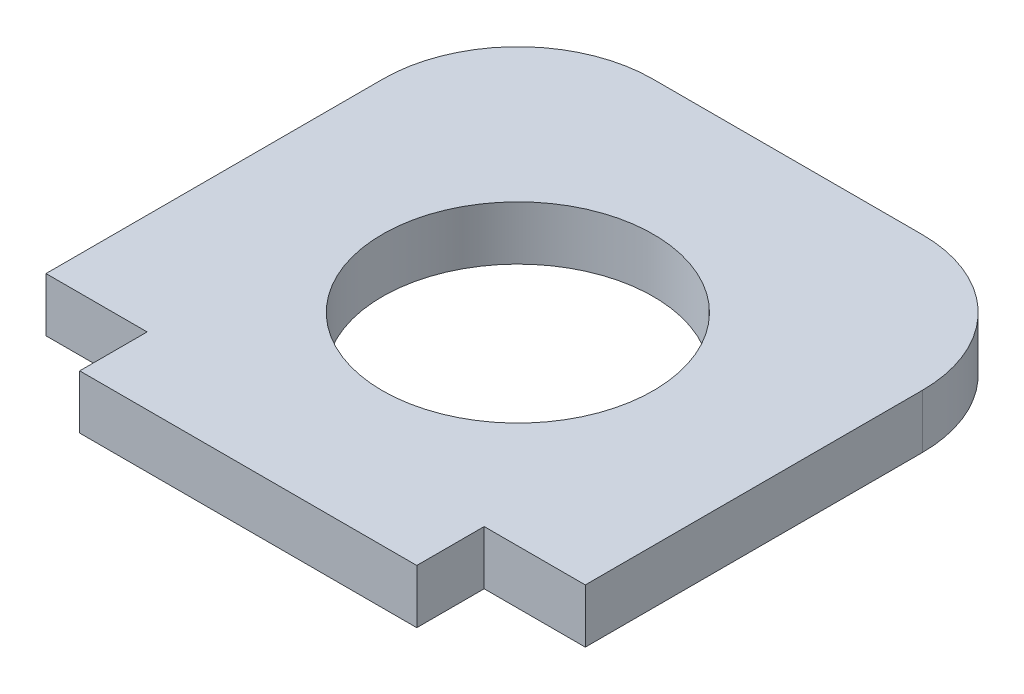
ISO-10303-21;
HEADER;
FILE_DESCRIPTION(('STEP AP214'),'2;1');
FILE_NAME('part.step','',(''),(''),'','','');
FILE_SCHEMA(('AUTOMOTIVE_DESIGN { 1 0 10303 214 1 1 1 1 }'));
ENDSEC;
DATA;
#1=APPLICATION_CONTEXT('core data for automotive mechanical design processes');
#2=APPLICATION_PROTOCOL_DEFINITION('international standard','automotive_design',2000,#1);
#3=PRODUCT_CONTEXT('',#1,'mechanical');
#4=PRODUCT('Part','Part','',(#3));
#5=PRODUCT_RELATED_PRODUCT_CATEGORY('part','',(#4));
#6=PRODUCT_DEFINITION_FORMATION('','',#4);
#7=PRODUCT_DEFINITION_CONTEXT('part definition',#1,'design');
#8=PRODUCT_DEFINITION('design','',#6,#7);
#9=PRODUCT_DEFINITION_SHAPE('','',#8);
#10=(LENGTH_UNIT() NAMED_UNIT(*) SI_UNIT(.MILLI.,.METRE.));
#11=(NAMED_UNIT(*) PLANE_ANGLE_UNIT() SI_UNIT($,.RADIAN.));
#12=(NAMED_UNIT(*) SI_UNIT($,.STERADIAN.) SOLID_ANGLE_UNIT());
#13=UNCERTAINTY_MEASURE_WITH_UNIT(LENGTH_MEASURE(1.E-05),#10,'distance_accuracy_value','');
#14=(GEOMETRIC_REPRESENTATION_CONTEXT(3) GLOBAL_UNCERTAINTY_ASSIGNED_CONTEXT((#13)) GLOBAL_UNIT_ASSIGNED_CONTEXT((#10,
#11,#12)) REPRESENTATION_CONTEXT('',''));
#15=CARTESIAN_POINT('',(0.,0.,0.));
#16=DIRECTION('',(0.,0.,1.));
#17=DIRECTION('',(1.,0.,0.));
#18=AXIS2_PLACEMENT_3D('',#15,#16,#17);
#19=CARTESIAN_POINT('',(12.5,4.,15.));
#20=DIRECTION('',(-1.,0.,0.));
#21=DIRECTION('',(0.,0.,1.));
#22=AXIS2_PLACEMENT_3D('',#19,#20,#21);
#23=PLANE('',#22);
#24=DIRECTION('',(0.,0.,-1.));
#25=VECTOR('',#24,1.);
#26=CARTESIAN_POINT('',(12.5,0.,15.));
#27=LINE('',#26,#25);
#28=CARTESIAN_POINT('',(12.5,0.,20.));
#29=VERTEX_POINT('',#28);
#30=CARTESIAN_POINT('',(12.5,0.,15.));
#31=VERTEX_POINT('',#30);
#32=EDGE_CURVE('E146',#29,#31,#27,.T.);
#33=ORIENTED_EDGE('',*,*,#32,.T.);
#34=DIRECTION('',(0.,-1.,0.));
#35=VECTOR('',#34,1.);
#36=CARTESIAN_POINT('',(12.5,4.,15.));
#37=LINE('',#36,#35);
#38=CARTESIAN_POINT('',(12.5,4.,15.));
#39=VERTEX_POINT('',#38);
#40=EDGE_CURVE('E129',#39,#31,#37,.T.);
#41=ORIENTED_EDGE('',*,*,#40,.F.);
#42=DIRECTION('',(0.,0.,-1.));
#43=VECTOR('',#42,1.);
#44=CARTESIAN_POINT('',(12.5,4.,15.));
#45=LINE('',#44,#43);
#46=CARTESIAN_POINT('',(12.5,4.,20.));
#47=VERTEX_POINT('',#46);
#48=EDGE_CURVE('E134',#47,#39,#45,.T.);
#49=ORIENTED_EDGE('',*,*,#48,.F.);
#50=DIRECTION('',(0.,-1.,0.));
#51=VECTOR('',#50,1.);
#52=CARTESIAN_POINT('',(12.5,4.,20.));
#53=LINE('',#52,#51);
#54=EDGE_CURVE('E194',#47,#29,#53,.T.);
#55=ORIENTED_EDGE('',*,*,#54,.T.);
#56=EDGE_LOOP('',(#33,#41,#49,#55));
#57=FACE_BOUND('',#56,.T.);
#58=ADVANCED_FACE('F45',(#57),#23,.F.);
#59=CARTESIAN_POINT('',(12.5,4.,15.));
#60=DIRECTION('',(0.,0.,-1.));
#61=DIRECTION('',(-1.,0.,0.));
#62=AXIS2_PLACEMENT_3D('',#59,#60,#61);
#63=PLANE('',#62);
#64=DIRECTION('',(1.,0.,0.));
#65=VECTOR('',#64,1.);
#66=CARTESIAN_POINT('',(12.5,0.,15.));
#67=LINE('',#66,#65);
#68=CARTESIAN_POINT('',(20.,0.,15.));
#69=VERTEX_POINT('',#68);
#70=EDGE_CURVE('E181',#31,#69,#67,.T.);
#71=ORIENTED_EDGE('',*,*,#70,.T.);
#72=DIRECTION('',(0.,-1.,0.));
#73=VECTOR('',#72,1.);
#74=CARTESIAN_POINT('',(20.,4.,15.));
#75=LINE('',#74,#73);
#76=CARTESIAN_POINT('',(20.,4.,15.));
#77=VERTEX_POINT('',#76);
#78=EDGE_CURVE('E132',#77,#69,#75,.T.);
#79=ORIENTED_EDGE('',*,*,#78,.F.);
#80=DIRECTION('',(1.,0.,0.));
#81=VECTOR('',#80,1.);
#82=CARTESIAN_POINT('',(12.5,4.,15.));
#83=LINE('',#82,#81);
#84=EDGE_CURVE('E125',#39,#77,#83,.T.);
#85=ORIENTED_EDGE('',*,*,#84,.F.);
#86=ORIENTED_EDGE('',*,*,#40,.T.);
#87=EDGE_LOOP('',(#71,#79,#85,#86));
#88=FACE_BOUND('',#87,.T.);
#89=ADVANCED_FACE('F127',(#88),#63,.F.);
#90=CARTESIAN_POINT('',(20.,4.,15.));
#91=DIRECTION('',(-1.,0.,0.));
#92=DIRECTION('',(0.,0.,1.));
#93=AXIS2_PLACEMENT_3D('',#90,#91,#92);
#94=PLANE('',#93);
#95=DIRECTION('',(0.,0.,-1.));
#96=VECTOR('',#95,1.);
#97=CARTESIAN_POINT('',(20.,0.,15.));
#98=LINE('',#97,#96);
#99=CARTESIAN_POINT('',(20.,0.,-10.));
#100=VERTEX_POINT('',#99);
#101=EDGE_CURVE('E178',#69,#100,#98,.T.);
#102=ORIENTED_EDGE('',*,*,#101,.T.);
#103=DIRECTION('',(0.,-1.,0.));
#104=VECTOR('',#103,1.);
#105=CARTESIAN_POINT('',(20.,4.,-10.));
#106=LINE('',#105,#104);
#107=CARTESIAN_POINT('',(20.,4.,-10.));
#108=VERTEX_POINT('',#107);
#109=EDGE_CURVE('E68',#100,#108,#106,.F.);
#110=ORIENTED_EDGE('',*,*,#109,.T.);
#111=DIRECTION('',(0.,0.,-1.));
#112=VECTOR('',#111,1.);
#113=CARTESIAN_POINT('',(20.,4.,15.));
#114=LINE('',#113,#112);
#115=EDGE_CURVE('E133',#77,#108,#114,.T.);
#116=ORIENTED_EDGE('',*,*,#115,.F.);
#117=ORIENTED_EDGE('',*,*,#78,.T.);
#118=EDGE_LOOP('',(#102,#110,#116,#117));
#119=FACE_BOUND('',#118,.T.);
#120=ADVANCED_FACE('F180',(#119),#94,.F.);
#121=CARTESIAN_POINT('',(20.,4.,-20.));
#122=DIRECTION('',(0.,0.,1.));
#123=DIRECTION('',(1.,0.,0.));
#124=AXIS2_PLACEMENT_3D('',#121,#122,#123);
#125=PLANE('',#124);
#126=DIRECTION('',(-1.,0.,0.));
#127=VECTOR('',#126,1.);
#128=CARTESIAN_POINT('',(20.,4.,-20.));
#129=LINE('',#128,#127);
#130=CARTESIAN_POINT('',(10.,4.,-20.));
#131=VERTEX_POINT('',#130);
#132=CARTESIAN_POINT('',(-10.,4.,-20.));
#133=VERTEX_POINT('',#132);
#134=EDGE_CURVE('E164',#131,#133,#129,.T.);
#135=ORIENTED_EDGE('',*,*,#134,.F.);
#136=DIRECTION('',(0.,-1.,0.));
#137=VECTOR('',#136,1.);
#138=CARTESIAN_POINT('',(10.,4.,-20.));
#139=LINE('',#138,#137);
#140=CARTESIAN_POINT('',(10.,0.,-20.));
#141=VERTEX_POINT('',#140);
#142=EDGE_CURVE('E149',#131,#141,#139,.T.);
#143=ORIENTED_EDGE('',*,*,#142,.T.);
#144=DIRECTION('',(-1.,0.,0.));
#145=VECTOR('',#144,1.);
#146=CARTESIAN_POINT('',(20.,0.,-20.));
#147=LINE('',#146,#145);
#148=CARTESIAN_POINT('',(-10.,0.,-20.));
#149=VERTEX_POINT('',#148);
#150=EDGE_CURVE('E179',#141,#149,#147,.T.);
#151=ORIENTED_EDGE('',*,*,#150,.T.);
#152=DIRECTION('',(0.,-1.,0.));
#153=VECTOR('',#152,1.);
#154=CARTESIAN_POINT('',(-10.,4.,-20.));
#155=LINE('',#154,#153);
#156=EDGE_CURVE('E147',#149,#133,#155,.F.);
#157=ORIENTED_EDGE('',*,*,#156,.T.);
#158=EDGE_LOOP('',(#135,#143,#151,#157));
#159=FACE_BOUND('',#158,.T.);
#160=ADVANCED_FACE('F168',(#159),#125,.F.);
#161=CARTESIAN_POINT('',(-20.,4.,15.));
#162=DIRECTION('',(1.,0.,0.));
#163=DIRECTION('',(0.,0.,-1.));
#164=AXIS2_PLACEMENT_3D('',#161,#162,#163);
#165=PLANE('',#164);
#166=DIRECTION('',(0.,0.,1.));
#167=VECTOR('',#166,1.);
#168=CARTESIAN_POINT('',(-20.,4.,15.));
#169=LINE('',#168,#167);
#170=CARTESIAN_POINT('',(-20.,4.,-10.));
#171=VERTEX_POINT('',#170);
#172=CARTESIAN_POINT('',(-20.,4.,15.));
#173=VERTEX_POINT('',#172);
#174=EDGE_CURVE('E172',#171,#173,#169,.T.);
#175=ORIENTED_EDGE('',*,*,#174,.F.);
#176=DIRECTION('',(0.,-1.,0.));
#177=VECTOR('',#176,1.);
#178=CARTESIAN_POINT('',(-20.,4.,-10.));
#179=LINE('',#178,#177);
#180=CARTESIAN_POINT('',(-20.,0.,-10.));
#181=VERTEX_POINT('',#180);
#182=EDGE_CURVE('E11',#171,#181,#179,.T.);
#183=ORIENTED_EDGE('',*,*,#182,.T.);
#184=DIRECTION('',(0.,0.,1.));
#185=VECTOR('',#184,1.);
#186=CARTESIAN_POINT('',(-20.,0.,15.));
#187=LINE('',#186,#185);
#188=CARTESIAN_POINT('',(-20.,0.,15.));
#189=VERTEX_POINT('',#188);
#190=EDGE_CURVE('E183',#181,#189,#187,.T.);
#191=ORIENTED_EDGE('',*,*,#190,.T.);
#192=DIRECTION('',(0.,-1.,0.));
#193=VECTOR('',#192,1.);
#194=CARTESIAN_POINT('',(-20.,4.,15.));
#195=LINE('',#194,#193);
#196=EDGE_CURVE('E151',#173,#189,#195,.T.);
#197=ORIENTED_EDGE('',*,*,#196,.F.);
#198=EDGE_LOOP('',(#175,#183,#191,#197));
#199=FACE_BOUND('',#198,.T.);
#200=ADVANCED_FACE('F234',(#199),#165,.F.);
#201=CARTESIAN_POINT('',(-20.,4.,15.));
#202=DIRECTION('',(0.,0.,-1.));
#203=DIRECTION('',(-1.,0.,0.));
#204=AXIS2_PLACEMENT_3D('',#201,#202,#203);
#205=PLANE('',#204);
#206=DIRECTION('',(1.,0.,0.));
#207=VECTOR('',#206,1.);
#208=CARTESIAN_POINT('',(-20.,0.,15.));
#209=LINE('',#208,#207);
#210=CARTESIAN_POINT('',(-12.5,0.,15.));
#211=VERTEX_POINT('',#210);
#212=EDGE_CURVE('E189',#189,#211,#209,.T.);
#213=ORIENTED_EDGE('',*,*,#212,.T.);
#214=DIRECTION('',(0.,-1.,0.));
#215=VECTOR('',#214,1.);
#216=CARTESIAN_POINT('',(-12.5,4.,15.));
#217=LINE('',#216,#215);
#218=CARTESIAN_POINT('',(-12.5,4.,15.));
#219=VERTEX_POINT('',#218);
#220=EDGE_CURVE('E199',#219,#211,#217,.T.);
#221=ORIENTED_EDGE('',*,*,#220,.F.);
#222=DIRECTION('',(1.,0.,0.));
#223=VECTOR('',#222,1.);
#224=CARTESIAN_POINT('',(-20.,4.,15.));
#225=LINE('',#224,#223);
#226=EDGE_CURVE('E208',#173,#219,#225,.T.);
#227=ORIENTED_EDGE('',*,*,#226,.F.);
#228=ORIENTED_EDGE('',*,*,#196,.T.);
#229=EDGE_LOOP('',(#213,#221,#227,#228));
#230=FACE_BOUND('',#229,.T.);
#231=ADVANCED_FACE('F206',(#230),#205,.F.);
#232=CARTESIAN_POINT('',(-12.5,4.,15.));
#233=DIRECTION('',(1.,0.,0.));
#234=DIRECTION('',(0.,0.,-1.));
#235=AXIS2_PLACEMENT_3D('',#232,#233,#234);
#236=PLANE('',#235);
#237=DIRECTION('',(0.,0.,1.));
#238=VECTOR('',#237,1.);
#239=CARTESIAN_POINT('',(-12.5,0.,15.));
#240=LINE('',#239,#238);
#241=CARTESIAN_POINT('',(-12.5,0.,20.));
#242=VERTEX_POINT('',#241);
#243=EDGE_CURVE('E191',#211,#242,#240,.T.);
#244=ORIENTED_EDGE('',*,*,#243,.T.);
#245=DIRECTION('',(0.,-1.,0.));
#246=VECTOR('',#245,1.);
#247=CARTESIAN_POINT('',(-12.5,4.,20.));
#248=LINE('',#247,#246);
#249=CARTESIAN_POINT('',(-12.5,4.,20.));
#250=VERTEX_POINT('',#249);
#251=EDGE_CURVE('E196',#250,#242,#248,.T.);
#252=ORIENTED_EDGE('',*,*,#251,.F.);
#253=DIRECTION('',(0.,0.,1.));
#254=VECTOR('',#253,1.);
#255=CARTESIAN_POINT('',(-12.5,4.,15.));
#256=LINE('',#255,#254);
#257=EDGE_CURVE('E219',#219,#250,#256,.T.);
#258=ORIENTED_EDGE('',*,*,#257,.F.);
#259=ORIENTED_EDGE('',*,*,#220,.T.);
#260=EDGE_LOOP('',(#244,#252,#258,#259));
#261=FACE_BOUND('',#260,.T.);
#262=ADVANCED_FACE('F215',(#261),#236,.F.);
#263=CARTESIAN_POINT('',(-12.5,4.,20.));
#264=DIRECTION('',(0.,0.,-1.));
#265=DIRECTION('',(-1.,0.,0.));
#266=AXIS2_PLACEMENT_3D('',#263,#264,#265);
#267=PLANE('',#266);
#268=DIRECTION('',(1.,0.,0.));
#269=VECTOR('',#268,1.);
#270=CARTESIAN_POINT('',(-12.5,0.,20.));
#271=LINE('',#270,#269);
#272=EDGE_CURVE('E143',#242,#29,#271,.T.);
#273=ORIENTED_EDGE('',*,*,#272,.T.);
#274=ORIENTED_EDGE('',*,*,#54,.F.);
#275=DIRECTION('',(1.,0.,0.));
#276=VECTOR('',#275,1.);
#277=CARTESIAN_POINT('',(-12.5,4.,20.));
#278=LINE('',#277,#276);
#279=EDGE_CURVE('E139',#250,#47,#278,.T.);
#280=ORIENTED_EDGE('',*,*,#279,.F.);
#281=ORIENTED_EDGE('',*,*,#251,.T.);
#282=EDGE_LOOP('',(#273,#274,#280,#281));
#283=FACE_BOUND('',#282,.T.);
#284=ADVANCED_FACE('F218',(#283),#267,.F.);
#285=CARTESIAN_POINT('',(0.,4.,0.));
#286=DIRECTION('',(0.,1.,0.));
#287=DIRECTION('',(0.,0.,1.));
#288=AXIS2_PLACEMENT_3D('',#285,#286,#287);
#289=PLANE('',#288);
#290=CARTESIAN_POINT('',(0.,4.,0.));
#291=DIRECTION('',(0.,1.,0.));
#292=DIRECTION('',(0.,0.,1.));
#293=AXIS2_PLACEMENT_3D('',#290,#291,#292);
#294=CIRCLE('',#293,10.05);
#295=CARTESIAN_POINT('',(0.,4.,10.05));
#296=VERTEX_POINT('',#295);
#297=EDGE_CURVE('E225',#296,#296,#294,.T.);
#298=ORIENTED_EDGE('',*,*,#297,.F.);
#299=EDGE_LOOP('',(#298));
#300=FACE_BOUND('',#299,.T.);
#301=ORIENTED_EDGE('',*,*,#115,.T.);
#302=CARTESIAN_POINT('',(10.,4.,-10.));
#303=DIRECTION('',(0.,1.,0.));
#304=DIRECTION('',(0.,0.,1.));
#305=AXIS2_PLACEMENT_3D('',#302,#303,#304);
#306=CIRCLE('',#305,10.);
#307=EDGE_CURVE('E53',#108,#131,#306,.T.);
#308=ORIENTED_EDGE('',*,*,#307,.T.);
#309=ORIENTED_EDGE('',*,*,#134,.T.);
#310=CARTESIAN_POINT('',(-10.,4.,-10.));
#311=DIRECTION('',(0.,1.,0.));
#312=DIRECTION('',(0.,0.,1.));
#313=AXIS2_PLACEMENT_3D('',#310,#311,#312);
#314=CIRCLE('',#313,10.);
#315=EDGE_CURVE('E60',#133,#171,#314,.T.);
#316=ORIENTED_EDGE('',*,*,#315,.T.);
#317=ORIENTED_EDGE('',*,*,#174,.T.);
#318=ORIENTED_EDGE('',*,*,#226,.T.);
#319=ORIENTED_EDGE('',*,*,#257,.T.);
#320=ORIENTED_EDGE('',*,*,#279,.T.);
#321=ORIENTED_EDGE('',*,*,#48,.T.);
#322=ORIENTED_EDGE('',*,*,#84,.T.);
#323=EDGE_LOOP('',(#301,#308,#309,#316,#317,#318,#319,#320,#321,#322));
#324=FACE_BOUND('',#323,.T.);
#325=ADVANCED_FACE('F137',(#300,#324),#289,.T.);
#326=CARTESIAN_POINT('',(0.,0.,0.));
#327=DIRECTION('',(0.,1.,0.));
#328=DIRECTION('',(0.,0.,1.));
#329=AXIS2_PLACEMENT_3D('',#326,#327,#328);
#330=PLANE('',#329);
#331=CARTESIAN_POINT('',(0.,0.,0.));
#332=DIRECTION('',(0.,1.,0.));
#333=DIRECTION('',(0.,0.,1.));
#334=AXIS2_PLACEMENT_3D('',#331,#332,#333);
#335=CIRCLE('',#334,10.05);
#336=CARTESIAN_POINT('',(0.,0.,10.05));
#337=VERTEX_POINT('',#336);
#338=EDGE_CURVE('E223',#337,#337,#335,.T.);
#339=ORIENTED_EDGE('',*,*,#338,.T.);
#340=EDGE_LOOP('',(#339));
#341=FACE_BOUND('',#340,.T.);
#342=ORIENTED_EDGE('',*,*,#150,.F.);
#343=CARTESIAN_POINT('',(10.,0.,-10.));
#344=DIRECTION('',(0.,1.,0.));
#345=DIRECTION('',(0.,0.,1.));
#346=AXIS2_PLACEMENT_3D('',#343,#344,#345);
#347=CIRCLE('',#346,10.);
#348=EDGE_CURVE('E159',#141,#100,#347,.F.);
#349=ORIENTED_EDGE('',*,*,#348,.T.);
#350=ORIENTED_EDGE('',*,*,#101,.F.);
#351=ORIENTED_EDGE('',*,*,#70,.F.);
#352=ORIENTED_EDGE('',*,*,#32,.F.);
#353=ORIENTED_EDGE('',*,*,#272,.F.);
#354=ORIENTED_EDGE('',*,*,#243,.F.);
#355=ORIENTED_EDGE('',*,*,#212,.F.);
#356=ORIENTED_EDGE('',*,*,#190,.F.);
#357=CARTESIAN_POINT('',(-10.,0.,-10.));
#358=DIRECTION('',(0.,1.,0.));
#359=DIRECTION('',(0.,0.,1.));
#360=AXIS2_PLACEMENT_3D('',#357,#358,#359);
#361=CIRCLE('',#360,10.);
#362=EDGE_CURVE('E157',#181,#149,#361,.F.);
#363=ORIENTED_EDGE('',*,*,#362,.T.);
#364=EDGE_LOOP('',(#342,#349,#350,#351,#352,#353,#354,#355,#356,#363));
#365=FACE_BOUND('',#364,.T.);
#366=ADVANCED_FACE('F177',(#341,#365),#330,.F.);
#367=CARTESIAN_POINT('',(0.,0.,0.));
#368=DIRECTION('',(0.,1.,0.));
#369=DIRECTION('',(0.,0.,1.));
#370=AXIS2_PLACEMENT_3D('',#367,#368,#369);
#371=CYLINDRICAL_SURFACE('',#370,10.05);
#372=ORIENTED_EDGE('',*,*,#338,.F.);
#373=EDGE_LOOP('',(#372));
#374=FACE_BOUND('',#373,.T.);
#375=ORIENTED_EDGE('',*,*,#297,.T.);
#376=EDGE_LOOP('',(#375));
#377=FACE_BOUND('',#376,.T.);
#378=ADVANCED_FACE('F240',(#374,#377),#371,.F.);
#379=CARTESIAN_POINT('',(10.,4.,-10.));
#380=DIRECTION('',(0.,-1.,0.));
#381=DIRECTION('',(0.,0.,-1.));
#382=AXIS2_PLACEMENT_3D('',#379,#380,#381);
#383=CYLINDRICAL_SURFACE('',#382,10.);
#384=ORIENTED_EDGE('',*,*,#307,.F.);
#385=ORIENTED_EDGE('',*,*,#109,.F.);
#386=ORIENTED_EDGE('',*,*,#348,.F.);
#387=ORIENTED_EDGE('',*,*,#142,.F.);
#388=EDGE_LOOP('',(#384,#385,#386,#387));
#389=FACE_BOUND('',#388,.T.);
#390=ADVANCED_FACE('F174',(#389),#383,.T.);
#391=CARTESIAN_POINT('',(-10.,4.,-10.));
#392=DIRECTION('',(0.,-1.,0.));
#393=DIRECTION('',(0.,0.,-1.));
#394=AXIS2_PLACEMENT_3D('',#391,#392,#393);
#395=CYLINDRICAL_SURFACE('',#394,10.);
#396=ORIENTED_EDGE('',*,*,#315,.F.);
#397=ORIENTED_EDGE('',*,*,#156,.F.);
#398=ORIENTED_EDGE('',*,*,#362,.F.);
#399=ORIENTED_EDGE('',*,*,#182,.F.);
#400=EDGE_LOOP('',(#396,#397,#398,#399));
#401=FACE_BOUND('',#400,.T.);
#402=ADVANCED_FACE('F47',(#401),#395,.T.);
#403=CLOSED_SHELL('',(#58,#89,#120,#160,#200,#231,#262,#284,#325,#366,#378,#390,#402));
#404=MANIFOLD_SOLID_BREP('B2',#403);
#405=ADVANCED_BREP_SHAPE_REPRESENTATION('',(#18,#404),#14);
#406=SHAPE_DEFINITION_REPRESENTATION(#9,#405);
ENDSEC;
END-ISO-10303-21;
